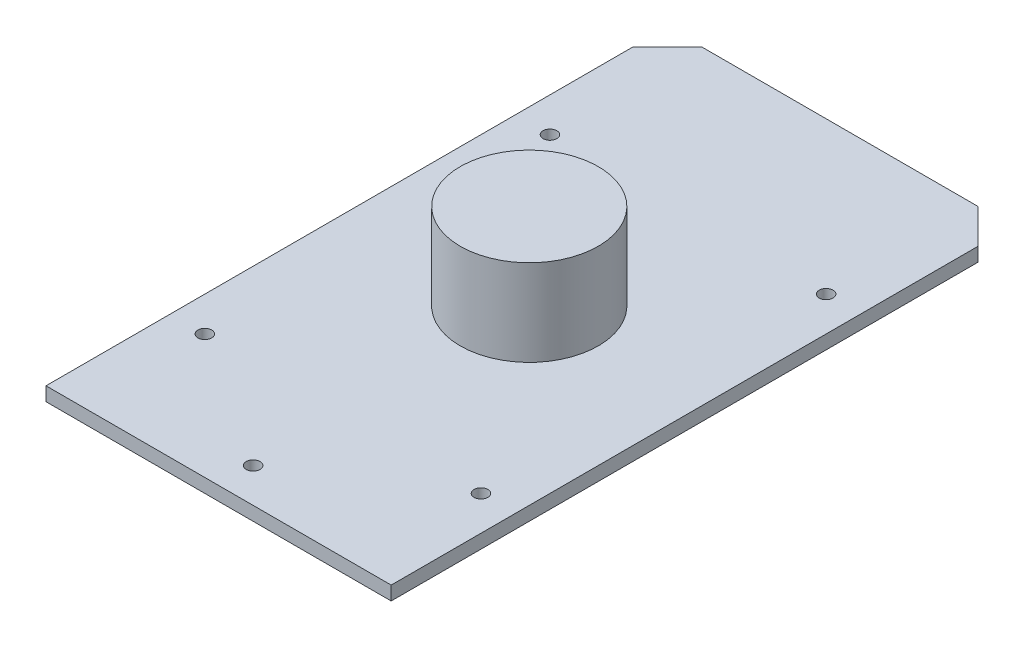
ISO-10303-21;
HEADER;
FILE_DESCRIPTION(('STEP AP214'),'2;1');
FILE_NAME('part.step','',(''),(''),'','','');
FILE_SCHEMA(('AUTOMOTIVE_DESIGN { 1 0 10303 214 1 1 1 1 }'));
ENDSEC;
DATA;
#1=APPLICATION_CONTEXT('core data for automotive mechanical design processes');
#2=APPLICATION_PROTOCOL_DEFINITION('international standard','automotive_design',2000,#1);
#3=PRODUCT_CONTEXT('',#1,'mechanical');
#4=PRODUCT('Part','Part','',(#3));
#5=PRODUCT_RELATED_PRODUCT_CATEGORY('part','',(#4));
#6=PRODUCT_DEFINITION_FORMATION('','',#4);
#7=PRODUCT_DEFINITION_CONTEXT('part definition',#1,'design');
#8=PRODUCT_DEFINITION('design','',#6,#7);
#9=PRODUCT_DEFINITION_SHAPE('','',#8);
#10=(LENGTH_UNIT() NAMED_UNIT(*) SI_UNIT(.MILLI.,.METRE.));
#11=(NAMED_UNIT(*) PLANE_ANGLE_UNIT() SI_UNIT($,.RADIAN.));
#12=(NAMED_UNIT(*) SI_UNIT($,.STERADIAN.) SOLID_ANGLE_UNIT());
#13=UNCERTAINTY_MEASURE_WITH_UNIT(LENGTH_MEASURE(1.E-05),#10,'distance_accuracy_value','');
#14=(GEOMETRIC_REPRESENTATION_CONTEXT(3) GLOBAL_UNCERTAINTY_ASSIGNED_CONTEXT((#13)) GLOBAL_UNIT_ASSIGNED_CONTEXT((#10,
#11,#12)) REPRESENTATION_CONTEXT('',''));
#15=CARTESIAN_POINT('',(0.,0.,0.));
#16=DIRECTION('',(0.,0.,1.));
#17=DIRECTION('',(1.,0.,0.));
#18=AXIS2_PLACEMENT_3D('',#15,#16,#17);
#19=CARTESIAN_POINT('',(250.,20.,-450.));
#20=DIRECTION('',(-1.,0.,0.));
#21=DIRECTION('',(0.,0.,1.));
#22=AXIS2_PLACEMENT_3D('',#19,#20,#21);
#23=PLANE('',#22);
#24=DIRECTION('',(0.,0.,-1.));
#25=VECTOR('',#24,1.);
#26=CARTESIAN_POINT('',(250.,0.,-450.));
#27=LINE('',#26,#25);
#28=CARTESIAN_POINT('',(250.,0.,450.));
#29=VERTEX_POINT('',#28);
#30=CARTESIAN_POINT('',(250.,0.,-400.));
#31=VERTEX_POINT('',#30);
#32=EDGE_CURVE('E134',#29,#31,#27,.T.);
#33=ORIENTED_EDGE('',*,*,#32,.T.);
#34=DIRECTION('',(0.,1.,0.));
#35=VECTOR('',#34,1.);
#36=CARTESIAN_POINT('',(250.,20.,-400.));
#37=LINE('',#36,#35);
#38=CARTESIAN_POINT('',(250.,20.,-400.));
#39=VERTEX_POINT('',#38);
#40=EDGE_CURVE('E11',#31,#39,#37,.T.);
#41=ORIENTED_EDGE('',*,*,#40,.T.);
#42=DIRECTION('',(0.,0.,-1.));
#43=VECTOR('',#42,1.);
#44=CARTESIAN_POINT('',(250.,20.,-450.));
#45=LINE('',#44,#43);
#46=CARTESIAN_POINT('',(250.,20.,450.));
#47=VERTEX_POINT('',#46);
#48=EDGE_CURVE('E145',#47,#39,#45,.T.);
#49=ORIENTED_EDGE('',*,*,#48,.F.);
#50=DIRECTION('',(0.,-1.,0.));
#51=VECTOR('',#50,1.);
#52=CARTESIAN_POINT('',(250.,20.,450.));
#53=LINE('',#52,#51);
#54=EDGE_CURVE('E124',#47,#29,#53,.T.);
#55=ORIENTED_EDGE('',*,*,#54,.T.);
#56=EDGE_LOOP('',(#33,#41,#49,#55));
#57=FACE_BOUND('',#56,.T.);
#58=ADVANCED_FACE('F46',(#57),#23,.F.);
#59=CARTESIAN_POINT('',(-250.,20.,-450.));
#60=DIRECTION('',(0.,0.,1.));
#61=DIRECTION('',(1.,0.,0.));
#62=AXIS2_PLACEMENT_3D('',#59,#60,#61);
#63=PLANE('',#62);
#64=DIRECTION('',(-1.,0.,0.));
#65=VECTOR('',#64,1.);
#66=CARTESIAN_POINT('',(-250.,0.,-450.));
#67=LINE('',#66,#65);
#68=CARTESIAN_POINT('',(200.,0.,-450.));
#69=VERTEX_POINT('',#68);
#70=CARTESIAN_POINT('',(-200.,0.,-450.));
#71=VERTEX_POINT('',#70);
#72=EDGE_CURVE('E137',#69,#71,#67,.T.);
#73=ORIENTED_EDGE('',*,*,#72,.T.);
#74=DIRECTION('',(0.,1.,0.));
#75=VECTOR('',#74,1.);
#76=CARTESIAN_POINT('',(-200.,20.,-450.));
#77=LINE('',#76,#75);
#78=CARTESIAN_POINT('',(-200.,20.,-450.));
#79=VERTEX_POINT('',#78);
#80=EDGE_CURVE('E69',#71,#79,#77,.T.);
#81=ORIENTED_EDGE('',*,*,#80,.T.);
#82=DIRECTION('',(-1.,0.,0.));
#83=VECTOR('',#82,1.);
#84=CARTESIAN_POINT('',(-250.,20.,-450.));
#85=LINE('',#84,#83);
#86=CARTESIAN_POINT('',(200.,20.,-450.));
#87=VERTEX_POINT('',#86);
#88=EDGE_CURVE('E113',#87,#79,#85,.T.);
#89=ORIENTED_EDGE('',*,*,#88,.F.);
#90=DIRECTION('',(0.,-1.,0.));
#91=VECTOR('',#90,1.);
#92=CARTESIAN_POINT('',(200.,20.,-450.));
#93=LINE('',#92,#91);
#94=EDGE_CURVE('E155',#87,#69,#93,.T.);
#95=ORIENTED_EDGE('',*,*,#94,.T.);
#96=EDGE_LOOP('',(#73,#81,#89,#95));
#97=FACE_BOUND('',#96,.T.);
#98=ADVANCED_FACE('F167',(#97),#63,.F.);
#99=CARTESIAN_POINT('',(-250.,20.,-450.));
#100=DIRECTION('',(1.,0.,0.));
#101=DIRECTION('',(0.,0.,-1.));
#102=AXIS2_PLACEMENT_3D('',#99,#100,#101);
#103=PLANE('',#102);
#104=DIRECTION('',(0.,0.,1.));
#105=VECTOR('',#104,1.);
#106=CARTESIAN_POINT('',(-250.,20.,-450.));
#107=LINE('',#106,#105);
#108=CARTESIAN_POINT('',(-250.,20.,-400.));
#109=VERTEX_POINT('',#108);
#110=CARTESIAN_POINT('',(-250.,20.,450.));
#111=VERTEX_POINT('',#110);
#112=EDGE_CURVE('E102',#109,#111,#107,.T.);
#113=ORIENTED_EDGE('',*,*,#112,.F.);
#114=DIRECTION('',(0.,-1.,0.));
#115=VECTOR('',#114,1.);
#116=CARTESIAN_POINT('',(-250.,20.,-400.));
#117=LINE('',#116,#115);
#118=CARTESIAN_POINT('',(-250.,0.,-400.));
#119=VERTEX_POINT('',#118);
#120=EDGE_CURVE('E123',#109,#119,#117,.T.);
#121=ORIENTED_EDGE('',*,*,#120,.T.);
#122=DIRECTION('',(0.,0.,1.));
#123=VECTOR('',#122,1.);
#124=CARTESIAN_POINT('',(-250.,0.,-450.));
#125=LINE('',#124,#123);
#126=CARTESIAN_POINT('',(-250.,0.,450.));
#127=VERTEX_POINT('',#126);
#128=EDGE_CURVE('E119',#119,#127,#125,.T.);
#129=ORIENTED_EDGE('',*,*,#128,.T.);
#130=DIRECTION('',(0.,-1.,0.));
#131=VECTOR('',#130,1.);
#132=CARTESIAN_POINT('',(-250.,20.,450.));
#133=LINE('',#132,#131);
#134=EDGE_CURVE('E116',#111,#127,#133,.T.);
#135=ORIENTED_EDGE('',*,*,#134,.F.);
#136=EDGE_LOOP('',(#113,#121,#129,#135));
#137=FACE_BOUND('',#136,.T.);
#138=ADVANCED_FACE('F117',(#137),#103,.F.);
#139=CARTESIAN_POINT('',(-250.,20.,450.));
#140=DIRECTION('',(0.,0.,-1.));
#141=DIRECTION('',(-1.,0.,0.));
#142=AXIS2_PLACEMENT_3D('',#139,#140,#141);
#143=PLANE('',#142);
#144=DIRECTION('',(1.,0.,0.));
#145=VECTOR('',#144,1.);
#146=CARTESIAN_POINT('',(-250.,0.,450.));
#147=LINE('',#146,#145);
#148=EDGE_CURVE('E143',#127,#29,#147,.T.);
#149=ORIENTED_EDGE('',*,*,#148,.T.);
#150=ORIENTED_EDGE('',*,*,#54,.F.);
#151=DIRECTION('',(1.,0.,0.));
#152=VECTOR('',#151,1.);
#153=CARTESIAN_POINT('',(-250.,20.,450.));
#154=LINE('',#153,#152);
#155=EDGE_CURVE('E106',#111,#47,#154,.T.);
#156=ORIENTED_EDGE('',*,*,#155,.F.);
#157=ORIENTED_EDGE('',*,*,#134,.T.);
#158=EDGE_LOOP('',(#149,#150,#156,#157));
#159=FACE_BOUND('',#158,.T.);
#160=ADVANCED_FACE('F126',(#159),#143,.F.);
#161=CARTESIAN_POINT('',(0.,20.,0.));
#162=DIRECTION('',(0.,1.,0.));
#163=DIRECTION('',(0.,0.,1.));
#164=AXIS2_PLACEMENT_3D('',#161,#162,#163);
#165=PLANE('',#164);
#166=CARTESIAN_POINT('',(0.,20.,400.));
#167=DIRECTION('',(0.,1.,0.));
#168=DIRECTION('',(0.,0.,1.));
#169=AXIS2_PLACEMENT_3D('',#166,#167,#168);
#170=CIRCLE('',#169,10.);
#171=CARTESIAN_POINT('',(0.,20.,410.));
#172=VERTEX_POINT('',#171);
#173=EDGE_CURVE('E216',#172,#172,#170,.T.);
#174=ORIENTED_EDGE('',*,*,#173,.F.);
#175=EDGE_LOOP('',(#174));
#176=FACE_BOUND('',#175,.T.);
#177=CARTESIAN_POINT('',(0.,20.,0.));
#178=DIRECTION('',(0.,1.,0.));
#179=DIRECTION('',(0.,0.,1.));
#180=AXIS2_PLACEMENT_3D('',#177,#178,#179);
#181=CIRCLE('',#180,100.);
#182=CARTESIAN_POINT('',(0.,20.,100.));
#183=VERTEX_POINT('',#182);
#184=EDGE_CURVE('E208',#183,#183,#181,.T.);
#185=ORIENTED_EDGE('',*,*,#184,.F.);
#186=EDGE_LOOP('',(#185));
#187=FACE_BOUND('',#186,.T.);
#188=CARTESIAN_POINT('',(-200.,20.,-230.));
#189=DIRECTION('',(0.,1.,0.));
#190=DIRECTION('',(0.,0.,1.));
#191=AXIS2_PLACEMENT_3D('',#188,#189,#190);
#192=CIRCLE('',#191,10.);
#193=CARTESIAN_POINT('',(-200.,20.,-220.));
#194=VERTEX_POINT('',#193);
#195=EDGE_CURVE('E180',#194,#194,#192,.T.);
#196=ORIENTED_EDGE('',*,*,#195,.F.);
#197=EDGE_LOOP('',(#196));
#198=FACE_BOUND('',#197,.T.);
#199=CARTESIAN_POINT('',(200.,20.,270.));
#200=DIRECTION('',(0.,1.,0.));
#201=DIRECTION('',(0.,0.,1.));
#202=AXIS2_PLACEMENT_3D('',#199,#200,#201);
#203=CIRCLE('',#202,10.);
#204=CARTESIAN_POINT('',(200.,20.,280.));
#205=VERTEX_POINT('',#204);
#206=EDGE_CURVE('E188',#205,#205,#203,.T.);
#207=ORIENTED_EDGE('',*,*,#206,.F.);
#208=EDGE_LOOP('',(#207));
#209=FACE_BOUND('',#208,.T.);
#210=CARTESIAN_POINT('',(-200.,20.,270.));
#211=DIRECTION('',(0.,1.,0.));
#212=DIRECTION('',(0.,0.,1.));
#213=AXIS2_PLACEMENT_3D('',#210,#211,#212);
#214=CIRCLE('',#213,10.);
#215=CARTESIAN_POINT('',(-200.,20.,280.));
#216=VERTEX_POINT('',#215);
#217=EDGE_CURVE('E189',#216,#216,#214,.T.);
#218=ORIENTED_EDGE('',*,*,#217,.F.);
#219=EDGE_LOOP('',(#218));
#220=FACE_BOUND('',#219,.T.);
#221=CARTESIAN_POINT('',(200.,20.,-230.));
#222=DIRECTION('',(0.,1.,0.));
#223=DIRECTION('',(0.,0.,1.));
#224=AXIS2_PLACEMENT_3D('',#221,#222,#223);
#225=CIRCLE('',#224,10.);
#226=CARTESIAN_POINT('',(200.,20.,-220.));
#227=VERTEX_POINT('',#226);
#228=EDGE_CURVE('E176',#227,#227,#225,.T.);
#229=ORIENTED_EDGE('',*,*,#228,.F.);
#230=EDGE_LOOP('',(#229));
#231=FACE_BOUND('',#230,.T.);
#232=ORIENTED_EDGE('',*,*,#88,.T.);
#233=DIRECTION('',(0.707106781186549,0.,-0.707106781186546));
#234=VECTOR('',#233,1.);
#235=CARTESIAN_POINT('',(-324.999999999999,20.,-325.000000000001));
#236=LINE('',#235,#234);
#237=EDGE_CURVE('E56',#79,#109,#236,.F.);
#238=ORIENTED_EDGE('',*,*,#237,.T.);
#239=ORIENTED_EDGE('',*,*,#112,.T.);
#240=ORIENTED_EDGE('',*,*,#155,.T.);
#241=ORIENTED_EDGE('',*,*,#48,.T.);
#242=DIRECTION('',(0.707106781186546,0.,0.707106781186549));
#243=VECTOR('',#242,1.);
#244=CARTESIAN_POINT('',(325.,20.,-324.999999999999));
#245=LINE('',#244,#243);
#246=EDGE_CURVE('E161',#39,#87,#245,.F.);
#247=ORIENTED_EDGE('',*,*,#246,.T.);
#248=EDGE_LOOP('',(#232,#238,#239,#240,#241,#247));
#249=FACE_BOUND('',#248,.T.);
#250=ADVANCED_FACE('F104',(#176,#187,#198,#209,#220,#231,#249),#165,.T.);
#251=CARTESIAN_POINT('',(0.,0.,0.));
#252=DIRECTION('',(0.,1.,0.));
#253=DIRECTION('',(0.,0.,1.));
#254=AXIS2_PLACEMENT_3D('',#251,#252,#253);
#255=PLANE('',#254);
#256=CARTESIAN_POINT('',(0.,0.,400.));
#257=DIRECTION('',(0.,1.,0.));
#258=DIRECTION('',(0.,0.,1.));
#259=AXIS2_PLACEMENT_3D('',#256,#257,#258);
#260=CIRCLE('',#259,10.);
#261=CARTESIAN_POINT('',(0.,0.,410.));
#262=VERTEX_POINT('',#261);
#263=EDGE_CURVE('E212',#262,#262,#260,.T.);
#264=ORIENTED_EDGE('',*,*,#263,.T.);
#265=EDGE_LOOP('',(#264));
#266=FACE_BOUND('',#265,.T.);
#267=CARTESIAN_POINT('',(-200.,0.,-230.));
#268=DIRECTION('',(0.,1.,0.));
#269=DIRECTION('',(0.,0.,1.));
#270=AXIS2_PLACEMENT_3D('',#267,#268,#269);
#271=CIRCLE('',#270,10.);
#272=CARTESIAN_POINT('',(-200.,0.,-220.));
#273=VERTEX_POINT('',#272);
#274=EDGE_CURVE('E193',#273,#273,#271,.T.);
#275=ORIENTED_EDGE('',*,*,#274,.T.);
#276=EDGE_LOOP('',(#275));
#277=FACE_BOUND('',#276,.T.);
#278=CARTESIAN_POINT('',(200.,0.,270.));
#279=DIRECTION('',(0.,1.,0.));
#280=DIRECTION('',(0.,0.,1.));
#281=AXIS2_PLACEMENT_3D('',#278,#279,#280);
#282=CIRCLE('',#281,10.);
#283=CARTESIAN_POINT('',(200.,0.,280.));
#284=VERTEX_POINT('',#283);
#285=EDGE_CURVE('E184',#284,#284,#282,.T.);
#286=ORIENTED_EDGE('',*,*,#285,.T.);
#287=EDGE_LOOP('',(#286));
#288=FACE_BOUND('',#287,.T.);
#289=CARTESIAN_POINT('',(-200.,0.,270.));
#290=DIRECTION('',(0.,1.,0.));
#291=DIRECTION('',(0.,0.,1.));
#292=AXIS2_PLACEMENT_3D('',#289,#290,#291);
#293=CIRCLE('',#292,10.);
#294=CARTESIAN_POINT('',(-200.,0.,280.));
#295=VERTEX_POINT('',#294);
#296=EDGE_CURVE('E200',#295,#295,#293,.T.);
#297=ORIENTED_EDGE('',*,*,#296,.T.);
#298=EDGE_LOOP('',(#297));
#299=FACE_BOUND('',#298,.T.);
#300=CARTESIAN_POINT('',(200.,0.,-230.));
#301=DIRECTION('',(0.,1.,0.));
#302=DIRECTION('',(0.,0.,1.));
#303=AXIS2_PLACEMENT_3D('',#300,#301,#302);
#304=CIRCLE('',#303,10.);
#305=CARTESIAN_POINT('',(200.,0.,-220.));
#306=VERTEX_POINT('',#305);
#307=EDGE_CURVE('E138',#306,#306,#304,.T.);
#308=ORIENTED_EDGE('',*,*,#307,.T.);
#309=EDGE_LOOP('',(#308));
#310=FACE_BOUND('',#309,.T.);
#311=ORIENTED_EDGE('',*,*,#128,.F.);
#312=DIRECTION('',(-0.707106781186549,0.,0.707106781186546));
#313=VECTOR('',#312,1.);
#314=CARTESIAN_POINT('',(-250.,0.,-400.));
#315=LINE('',#314,#313);
#316=EDGE_CURVE('E152',#119,#71,#315,.F.);
#317=ORIENTED_EDGE('',*,*,#316,.T.);
#318=ORIENTED_EDGE('',*,*,#72,.F.);
#319=DIRECTION('',(-0.707106781186546,0.,-0.707106781186549));
#320=VECTOR('',#319,1.);
#321=CARTESIAN_POINT('',(200.,0.,-450.));
#322=LINE('',#321,#320);
#323=EDGE_CURVE('E149',#69,#31,#322,.F.);
#324=ORIENTED_EDGE('',*,*,#323,.T.);
#325=ORIENTED_EDGE('',*,*,#32,.F.);
#326=ORIENTED_EDGE('',*,*,#148,.F.);
#327=EDGE_LOOP('',(#311,#317,#318,#324,#325,#326));
#328=FACE_BOUND('',#327,.T.);
#329=ADVANCED_FACE('F172',(#266,#277,#288,#299,#310,#328),#255,.F.);
#330=CARTESIAN_POINT('',(-250.,20.,-400.));
#331=DIRECTION('',(0.707106781186546,0.,0.707106781186549));
#332=DIRECTION('',(0.,-1.,0.));
#333=AXIS2_PLACEMENT_3D('',#330,#331,#332);
#334=PLANE('',#333);
#335=ORIENTED_EDGE('',*,*,#237,.F.);
#336=ORIENTED_EDGE('',*,*,#80,.F.);
#337=ORIENTED_EDGE('',*,*,#316,.F.);
#338=ORIENTED_EDGE('',*,*,#120,.F.);
#339=EDGE_LOOP('',(#335,#336,#337,#338));
#340=FACE_BOUND('',#339,.T.);
#341=ADVANCED_FACE('F258',(#340),#334,.F.);
#342=CARTESIAN_POINT('',(200.,20.,-450.));
#343=DIRECTION('',(-0.707106781186549,0.,0.707106781186546));
#344=DIRECTION('',(0.,-1.,0.));
#345=AXIS2_PLACEMENT_3D('',#342,#343,#344);
#346=PLANE('',#345);
#347=ORIENTED_EDGE('',*,*,#246,.F.);
#348=ORIENTED_EDGE('',*,*,#40,.F.);
#349=ORIENTED_EDGE('',*,*,#323,.F.);
#350=ORIENTED_EDGE('',*,*,#94,.F.);
#351=EDGE_LOOP('',(#347,#348,#349,#350));
#352=FACE_BOUND('',#351,.T.);
#353=ADVANCED_FACE('F49',(#352),#346,.F.);
#354=CARTESIAN_POINT('',(200.,0.,-230.));
#355=DIRECTION('',(0.,1.,0.));
#356=DIRECTION('',(0.,0.,1.));
#357=AXIS2_PLACEMENT_3D('',#354,#355,#356);
#358=CYLINDRICAL_SURFACE('',#357,10.);
#359=ORIENTED_EDGE('',*,*,#307,.F.);
#360=EDGE_LOOP('',(#359));
#361=FACE_BOUND('',#360,.T.);
#362=ORIENTED_EDGE('',*,*,#228,.T.);
#363=EDGE_LOOP('',(#362));
#364=FACE_BOUND('',#363,.T.);
#365=ADVANCED_FACE('F246',(#361,#364),#358,.F.);
#366=CARTESIAN_POINT('',(-200.,0.,270.));
#367=DIRECTION('',(0.,1.,0.));
#368=DIRECTION('',(0.,0.,1.));
#369=AXIS2_PLACEMENT_3D('',#366,#367,#368);
#370=CYLINDRICAL_SURFACE('',#369,10.);
#371=ORIENTED_EDGE('',*,*,#296,.F.);
#372=EDGE_LOOP('',(#371));
#373=FACE_BOUND('',#372,.T.);
#374=ORIENTED_EDGE('',*,*,#217,.T.);
#375=EDGE_LOOP('',(#374));
#376=FACE_BOUND('',#375,.T.);
#377=ADVANCED_FACE('F248',(#373,#376),#370,.F.);
#378=CARTESIAN_POINT('',(200.,0.,270.));
#379=DIRECTION('',(0.,1.,0.));
#380=DIRECTION('',(0.,0.,1.));
#381=AXIS2_PLACEMENT_3D('',#378,#379,#380);
#382=CYLINDRICAL_SURFACE('',#381,10.);
#383=ORIENTED_EDGE('',*,*,#285,.F.);
#384=EDGE_LOOP('',(#383));
#385=FACE_BOUND('',#384,.T.);
#386=ORIENTED_EDGE('',*,*,#206,.T.);
#387=EDGE_LOOP('',(#386));
#388=FACE_BOUND('',#387,.T.);
#389=ADVANCED_FACE('F255',(#385,#388),#382,.F.);
#390=CARTESIAN_POINT('',(-200.,0.,-230.));
#391=DIRECTION('',(0.,1.,0.));
#392=DIRECTION('',(0.,0.,1.));
#393=AXIS2_PLACEMENT_3D('',#390,#391,#392);
#394=CYLINDRICAL_SURFACE('',#393,10.);
#395=ORIENTED_EDGE('',*,*,#274,.F.);
#396=EDGE_LOOP('',(#395));
#397=FACE_BOUND('',#396,.T.);
#398=ORIENTED_EDGE('',*,*,#195,.T.);
#399=EDGE_LOOP('',(#398));
#400=FACE_BOUND('',#399,.T.);
#401=ADVANCED_FACE('F335',(#397,#400),#394,.F.);
#402=CARTESIAN_POINT('',(0.,145.,0.));
#403=DIRECTION('',(0.,-1.,0.));
#404=DIRECTION('',(0.,0.,-1.));
#405=AXIS2_PLACEMENT_3D('',#402,#403,#404);
#406=CYLINDRICAL_SURFACE('',#405,100.);
#407=CARTESIAN_POINT('',(0.,145.,0.));
#408=DIRECTION('',(0.,1.,0.));
#409=DIRECTION('',(0.,0.,1.));
#410=AXIS2_PLACEMENT_3D('',#407,#408,#409);
#411=CIRCLE('',#410,100.);
#412=CARTESIAN_POINT('',(0.,145.,100.));
#413=VERTEX_POINT('',#412);
#414=EDGE_CURVE('E204',#413,#413,#411,.T.);
#415=ORIENTED_EDGE('',*,*,#414,.F.);
#416=EDGE_LOOP('',(#415));
#417=FACE_BOUND('',#416,.T.);
#418=ORIENTED_EDGE('',*,*,#184,.T.);
#419=EDGE_LOOP('',(#418));
#420=FACE_BOUND('',#419,.T.);
#421=ADVANCED_FACE('F343',(#417,#420),#406,.T.);
#422=CARTESIAN_POINT('',(0.,145.,0.));
#423=DIRECTION('',(0.,1.,0.));
#424=DIRECTION('',(0.,0.,1.));
#425=AXIS2_PLACEMENT_3D('',#422,#423,#424);
#426=PLANE('',#425);
#427=ORIENTED_EDGE('',*,*,#414,.T.);
#428=EDGE_LOOP('',(#427));
#429=FACE_BOUND('',#428,.T.);
#430=ADVANCED_FACE('F229',(#429),#426,.T.);
#431=CARTESIAN_POINT('',(0.,0.,400.));
#432=DIRECTION('',(0.,1.,0.));
#433=DIRECTION('',(0.,0.,1.));
#434=AXIS2_PLACEMENT_3D('',#431,#432,#433);
#435=CYLINDRICAL_SURFACE('',#434,10.);
#436=ORIENTED_EDGE('',*,*,#263,.F.);
#437=EDGE_LOOP('',(#436));
#438=FACE_BOUND('',#437,.T.);
#439=ORIENTED_EDGE('',*,*,#173,.T.);
#440=EDGE_LOOP('',(#439));
#441=FACE_BOUND('',#440,.T.);
#442=ADVANCED_FACE('F226',(#438,#441),#435,.F.);
#443=CLOSED_SHELL('',(#58,#98,#138,#160,#250,#329,#341,#353,#365,#377,#389,#401,#421,#430,#442));
#444=MANIFOLD_SOLID_BREP('B2',#443);
#445=ADVANCED_BREP_SHAPE_REPRESENTATION('',(#18,#444),#14);
#446=SHAPE_DEFINITION_REPRESENTATION(#9,#445);
ENDSEC;
END-ISO-10303-21;
